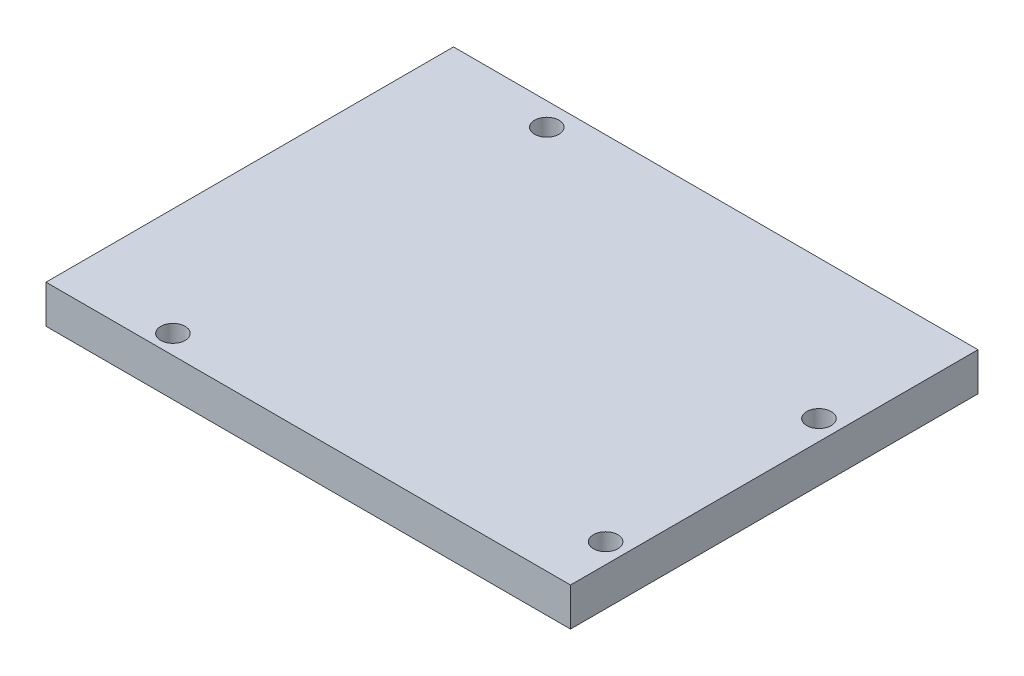
ISO-10303-21;
HEADER;
FILE_DESCRIPTION(('STEP AP214'),'2;1');
FILE_NAME('part.step','',(''),(''),'','','');
FILE_SCHEMA(('AUTOMOTIVE_DESIGN { 1 0 10303 214 1 1 1 1 }'));
ENDSEC;
DATA;
#1=APPLICATION_CONTEXT('core data for automotive mechanical design processes');
#2=APPLICATION_PROTOCOL_DEFINITION('international standard','automotive_design',2000,#1);
#3=PRODUCT_CONTEXT('',#1,'mechanical');
#4=PRODUCT('Part','Part','',(#3));
#5=PRODUCT_RELATED_PRODUCT_CATEGORY('part','',(#4));
#6=PRODUCT_DEFINITION_FORMATION('','',#4);
#7=PRODUCT_DEFINITION_CONTEXT('part definition',#1,'design');
#8=PRODUCT_DEFINITION('design','',#6,#7);
#9=PRODUCT_DEFINITION_SHAPE('','',#8);
#10=(LENGTH_UNIT() NAMED_UNIT(*) SI_UNIT(.MILLI.,.METRE.));
#11=(NAMED_UNIT(*) PLANE_ANGLE_UNIT() SI_UNIT($,.RADIAN.));
#12=(NAMED_UNIT(*) SI_UNIT($,.STERADIAN.) SOLID_ANGLE_UNIT());
#13=UNCERTAINTY_MEASURE_WITH_UNIT(LENGTH_MEASURE(1.E-05),#10,'distance_accuracy_value','');
#14=(GEOMETRIC_REPRESENTATION_CONTEXT(3) GLOBAL_UNCERTAINTY_ASSIGNED_CONTEXT((#13)) GLOBAL_UNIT_ASSIGNED_CONTEXT((#10,
#11,#12)) REPRESENTATION_CONTEXT('',''));
#15=CARTESIAN_POINT('',(0.,0.,0.));
#16=DIRECTION('',(0.,0.,1.));
#17=DIRECTION('',(1.,0.,0.));
#18=AXIS2_PLACEMENT_3D('',#15,#16,#17);
#19=CARTESIAN_POINT('',(0.,5.,0.));
#20=DIRECTION('',(0.,-1.,0.));
#21=DIRECTION('',(0.,0.,-1.));
#22=AXIS2_PLACEMENT_3D('',#19,#20,#21);
#23=PLANE('',#22);
#24=DIRECTION('',(0.,0.,1.));
#25=VECTOR('',#24,1.);
#26=CARTESIAN_POINT('',(-35.5276832904799,5.,25.6269305912668));
#27=LINE('',#26,#25);
#28=CARTESIAN_POINT('',(-35.5276832904799,5.,-27.6730694087332));
#29=VERTEX_POINT('',#28);
#30=CARTESIAN_POINT('',(-35.5276832904799,5.,25.6269305912668));
#31=VERTEX_POINT('',#30);
#32=EDGE_CURVE('E84',#29,#31,#27,.T.);
#33=ORIENTED_EDGE('',*,*,#32,.T.);
#34=DIRECTION('',(1.,0.,0.));
#35=VECTOR('',#34,1.);
#36=CARTESIAN_POINT('',(-35.5276832904799,5.,25.6269305912668));
#37=LINE('',#36,#35);
#38=CARTESIAN_POINT('',(33.0723167095201,5.,25.6269305912668));
#39=VERTEX_POINT('',#38);
#40=EDGE_CURVE('E79',#31,#39,#37,.T.);
#41=ORIENTED_EDGE('',*,*,#40,.T.);
#42=DIRECTION('',(0.,0.,-1.));
#43=VECTOR('',#42,1.);
#44=CARTESIAN_POINT('',(33.0723167095201,5.,25.6269305912668));
#45=LINE('',#44,#43);
#46=CARTESIAN_POINT('',(33.0723167095201,5.,-27.6730694087332));
#47=VERTEX_POINT('',#46);
#48=EDGE_CURVE('E82',#39,#47,#45,.T.);
#49=ORIENTED_EDGE('',*,*,#48,.T.);
#50=DIRECTION('',(-1.,0.,0.));
#51=VECTOR('',#50,1.);
#52=CARTESIAN_POINT('',(-35.5276832904799,5.,-27.6730694087332));
#53=LINE('',#52,#51);
#54=EDGE_CURVE('E49',#47,#29,#53,.T.);
#55=ORIENTED_EDGE('',*,*,#54,.T.);
#56=EDGE_LOOP('',(#33,#41,#49,#55));
#57=FACE_BOUND('',#56,.T.);
#58=CARTESIAN_POINT('',(30.4723167095201,5.,18.4269305912668));
#59=DIRECTION('',(0.,1.,0.));
#60=DIRECTION('',(0.,0.,1.));
#61=AXIS2_PLACEMENT_3D('',#58,#59,#60);
#62=CIRCLE('',#61,1.6);
#63=CARTESIAN_POINT('',(30.4723167095201,5.,20.0269305912668));
#64=VERTEX_POINT('',#63);
#65=EDGE_CURVE('E99',#64,#64,#62,.T.);
#66=ORIENTED_EDGE('',*,*,#65,.F.);
#67=EDGE_LOOP('',(#66));
#68=FACE_BOUND('',#67,.T.);
#69=CARTESIAN_POINT('',(30.4723167095201,5.,-9.47306940873323));
#70=DIRECTION('',(0.,1.,0.));
#71=DIRECTION('',(0.,0.,1.));
#72=AXIS2_PLACEMENT_3D('',#69,#70,#71);
#73=CIRCLE('',#72,1.60000000000001);
#74=CARTESIAN_POINT('',(30.4723167095201,5.,-7.87306940873322));
#75=VERTEX_POINT('',#74);
#76=EDGE_CURVE('E114',#75,#75,#73,.T.);
#77=ORIENTED_EDGE('',*,*,#76,.F.);
#78=EDGE_LOOP('',(#77));
#79=FACE_BOUND('',#78,.T.);
#80=CARTESIAN_POINT('',(-20.3276832904799,5.,-24.6730694087332));
#81=DIRECTION('',(0.,1.,0.));
#82=DIRECTION('',(0.,0.,1.));
#83=AXIS2_PLACEMENT_3D('',#80,#81,#82);
#84=CIRCLE('',#83,1.60000000000001);
#85=CARTESIAN_POINT('',(-20.3276832904799,5.,-23.0730694087332));
#86=VERTEX_POINT('',#85);
#87=EDGE_CURVE('E120',#86,#86,#84,.T.);
#88=ORIENTED_EDGE('',*,*,#87,.F.);
#89=EDGE_LOOP('',(#88));
#90=FACE_BOUND('',#89,.T.);
#91=CARTESIAN_POINT('',(-21.4276832904799,5.,23.1269305912668));
#92=DIRECTION('',(0.,1.,0.));
#93=DIRECTION('',(0.,0.,1.));
#94=AXIS2_PLACEMENT_3D('',#91,#92,#93);
#95=CIRCLE('',#94,1.59999999999999);
#96=CARTESIAN_POINT('',(-21.4276832904799,5.,24.7269305912668));
#97=VERTEX_POINT('',#96);
#98=EDGE_CURVE('E126',#97,#97,#95,.T.);
#99=ORIENTED_EDGE('',*,*,#98,.F.);
#100=EDGE_LOOP('',(#99));
#101=FACE_BOUND('',#100,.T.);
#102=ADVANCED_FACE('F32',(#57,#68,#79,#90,#101),#23,.F.);
#103=CARTESIAN_POINT('',(0.,0.,0.));
#104=DIRECTION('',(0.,-1.,0.));
#105=DIRECTION('',(0.,0.,-1.));
#106=AXIS2_PLACEMENT_3D('',#103,#104,#105);
#107=PLANE('',#106);
#108=CARTESIAN_POINT('',(-20.3276832904799,0.,-24.6730694087332));
#109=DIRECTION('',(0.,1.,0.));
#110=DIRECTION('',(0.,0.,1.));
#111=AXIS2_PLACEMENT_3D('',#108,#109,#110);
#112=CIRCLE('',#111,1.60000000000001);
#113=CARTESIAN_POINT('',(-20.3276832904799,0.,-23.0730694087332));
#114=VERTEX_POINT('',#113);
#115=EDGE_CURVE('E123',#114,#114,#112,.T.);
#116=ORIENTED_EDGE('',*,*,#115,.T.);
#117=EDGE_LOOP('',(#116));
#118=FACE_BOUND('',#117,.T.);
#119=CARTESIAN_POINT('',(30.4723167095201,0.,18.4269305912668));
#120=DIRECTION('',(0.,1.,0.));
#121=DIRECTION('',(0.,0.,1.));
#122=AXIS2_PLACEMENT_3D('',#119,#120,#121);
#123=CIRCLE('',#122,1.6);
#124=CARTESIAN_POINT('',(30.4723167095201,0.,20.0269305912668));
#125=VERTEX_POINT('',#124);
#126=EDGE_CURVE('E111',#125,#125,#123,.T.);
#127=ORIENTED_EDGE('',*,*,#126,.T.);
#128=EDGE_LOOP('',(#127));
#129=FACE_BOUND('',#128,.T.);
#130=DIRECTION('',(0.,0.,1.));
#131=VECTOR('',#130,1.);
#132=CARTESIAN_POINT('',(-35.5276832904799,0.,25.6269305912668));
#133=LINE('',#132,#131);
#134=CARTESIAN_POINT('',(-35.5276832904799,0.,-27.6730694087332));
#135=VERTEX_POINT('',#134);
#136=CARTESIAN_POINT('',(-35.5276832904799,0.,25.6269305912668));
#137=VERTEX_POINT('',#136);
#138=EDGE_CURVE('E96',#135,#137,#133,.T.);
#139=ORIENTED_EDGE('',*,*,#138,.F.);
#140=DIRECTION('',(-1.,0.,0.));
#141=VECTOR('',#140,1.);
#142=CARTESIAN_POINT('',(-35.5276832904799,0.,-27.6730694087332));
#143=LINE('',#142,#141);
#144=CARTESIAN_POINT('',(33.0723167095201,0.,-27.6730694087332));
#145=VERTEX_POINT('',#144);
#146=EDGE_CURVE('E72',#145,#135,#143,.T.);
#147=ORIENTED_EDGE('',*,*,#146,.F.);
#148=DIRECTION('',(0.,0.,-1.));
#149=VECTOR('',#148,1.);
#150=CARTESIAN_POINT('',(33.0723167095201,0.,25.6269305912668));
#151=LINE('',#150,#149);
#152=CARTESIAN_POINT('',(33.0723167095201,0.,25.6269305912668));
#153=VERTEX_POINT('',#152);
#154=EDGE_CURVE('E66',#153,#145,#151,.T.);
#155=ORIENTED_EDGE('',*,*,#154,.F.);
#156=DIRECTION('',(1.,0.,0.));
#157=VECTOR('',#156,1.);
#158=CARTESIAN_POINT('',(-35.5276832904799,0.,25.6269305912668));
#159=LINE('',#158,#157);
#160=EDGE_CURVE('E88',#137,#153,#159,.T.);
#161=ORIENTED_EDGE('',*,*,#160,.F.);
#162=EDGE_LOOP('',(#139,#147,#155,#161));
#163=FACE_BOUND('',#162,.T.);
#164=CARTESIAN_POINT('',(30.4723167095201,0.,-9.47306940873323));
#165=DIRECTION('',(0.,1.,0.));
#166=DIRECTION('',(0.,0.,1.));
#167=AXIS2_PLACEMENT_3D('',#164,#165,#166);
#168=CIRCLE('',#167,1.60000000000001);
#169=CARTESIAN_POINT('',(30.4723167095201,0.,-7.87306940873322));
#170=VERTEX_POINT('',#169);
#171=EDGE_CURVE('E117',#170,#170,#168,.T.);
#172=ORIENTED_EDGE('',*,*,#171,.T.);
#173=EDGE_LOOP('',(#172));
#174=FACE_BOUND('',#173,.T.);
#175=CARTESIAN_POINT('',(-21.4276832904799,0.,23.1269305912668));
#176=DIRECTION('',(0.,1.,0.));
#177=DIRECTION('',(0.,0.,1.));
#178=AXIS2_PLACEMENT_3D('',#175,#176,#177);
#179=CIRCLE('',#178,1.59999999999999);
#180=CARTESIAN_POINT('',(-21.4276832904799,0.,24.7269305912668));
#181=VERTEX_POINT('',#180);
#182=EDGE_CURVE('E129',#181,#181,#179,.T.);
#183=ORIENTED_EDGE('',*,*,#182,.T.);
#184=EDGE_LOOP('',(#183));
#185=FACE_BOUND('',#184,.T.);
#186=ADVANCED_FACE('F107',(#118,#129,#163,#174,#185),#107,.T.);
#187=CARTESIAN_POINT('',(-35.5276832904799,5.,25.6269305912668));
#188=DIRECTION('',(1.,0.,0.));
#189=DIRECTION('',(0.,0.,-1.));
#190=AXIS2_PLACEMENT_3D('',#187,#188,#189);
#191=PLANE('',#190);
#192=ORIENTED_EDGE('',*,*,#138,.T.);
#193=DIRECTION('',(0.,-1.,0.));
#194=VECTOR('',#193,1.);
#195=CARTESIAN_POINT('',(-35.5276832904799,5.,25.6269305912668));
#196=LINE('',#195,#194);
#197=EDGE_CURVE('E11',#31,#137,#196,.T.);
#198=ORIENTED_EDGE('',*,*,#197,.F.);
#199=ORIENTED_EDGE('',*,*,#32,.F.);
#200=DIRECTION('',(0.,-1.,0.));
#201=VECTOR('',#200,1.);
#202=CARTESIAN_POINT('',(-35.5276832904799,5.,-27.6730694087332));
#203=LINE('',#202,#201);
#204=EDGE_CURVE('E92',#29,#135,#203,.T.);
#205=ORIENTED_EDGE('',*,*,#204,.T.);
#206=EDGE_LOOP('',(#192,#198,#199,#205));
#207=FACE_BOUND('',#206,.T.);
#208=ADVANCED_FACE('F34',(#207),#191,.F.);
#209=CARTESIAN_POINT('',(-35.5276832904799,5.,25.6269305912668));
#210=DIRECTION('',(0.,0.,-1.));
#211=DIRECTION('',(-1.,0.,0.));
#212=AXIS2_PLACEMENT_3D('',#209,#210,#211);
#213=PLANE('',#212);
#214=ORIENTED_EDGE('',*,*,#160,.T.);
#215=DIRECTION('',(0.,-1.,0.));
#216=VECTOR('',#215,1.);
#217=CARTESIAN_POINT('',(33.0723167095201,5.,25.6269305912668));
#218=LINE('',#217,#216);
#219=EDGE_CURVE('E41',#39,#153,#218,.T.);
#220=ORIENTED_EDGE('',*,*,#219,.F.);
#221=ORIENTED_EDGE('',*,*,#40,.F.);
#222=ORIENTED_EDGE('',*,*,#197,.T.);
#223=EDGE_LOOP('',(#214,#220,#221,#222));
#224=FACE_BOUND('',#223,.T.);
#225=ADVANCED_FACE('F87',(#224),#213,.F.);
#226=CARTESIAN_POINT('',(33.0723167095201,5.,25.6269305912668));
#227=DIRECTION('',(-1.,0.,0.));
#228=DIRECTION('',(0.,0.,1.));
#229=AXIS2_PLACEMENT_3D('',#226,#227,#228);
#230=PLANE('',#229);
#231=ORIENTED_EDGE('',*,*,#154,.T.);
#232=DIRECTION('',(0.,-1.,0.));
#233=VECTOR('',#232,1.);
#234=CARTESIAN_POINT('',(33.0723167095201,5.,-27.6730694087332));
#235=LINE('',#234,#233);
#236=EDGE_CURVE('E89',#47,#145,#235,.T.);
#237=ORIENTED_EDGE('',*,*,#236,.F.);
#238=ORIENTED_EDGE('',*,*,#48,.F.);
#239=ORIENTED_EDGE('',*,*,#219,.T.);
#240=EDGE_LOOP('',(#231,#237,#238,#239));
#241=FACE_BOUND('',#240,.T.);
#242=ADVANCED_FACE('F90',(#241),#230,.F.);
#243=CARTESIAN_POINT('',(-35.5276832904799,5.,-27.6730694087332));
#244=DIRECTION('',(0.,0.,1.));
#245=DIRECTION('',(1.,0.,0.));
#246=AXIS2_PLACEMENT_3D('',#243,#244,#245);
#247=PLANE('',#246);
#248=ORIENTED_EDGE('',*,*,#146,.T.);
#249=ORIENTED_EDGE('',*,*,#204,.F.);
#250=ORIENTED_EDGE('',*,*,#54,.F.);
#251=ORIENTED_EDGE('',*,*,#236,.T.);
#252=EDGE_LOOP('',(#248,#249,#250,#251));
#253=FACE_BOUND('',#252,.T.);
#254=ADVANCED_FACE('F104',(#253),#247,.F.);
#255=CARTESIAN_POINT('',(30.4723167095201,5.,18.4269305912668));
#256=DIRECTION('',(0.,-1.,0.));
#257=DIRECTION('',(0.,0.,-1.));
#258=AXIS2_PLACEMENT_3D('',#255,#256,#257);
#259=CYLINDRICAL_SURFACE('',#258,1.6);
#260=ORIENTED_EDGE('',*,*,#65,.T.);
#261=EDGE_LOOP('',(#260));
#262=FACE_BOUND('',#261,.T.);
#263=ORIENTED_EDGE('',*,*,#126,.F.);
#264=EDGE_LOOP('',(#263));
#265=FACE_BOUND('',#264,.T.);
#266=ADVANCED_FACE('F146',(#262,#265),#259,.F.);
#267=CARTESIAN_POINT('',(30.4723167095201,5.,-9.47306940873323));
#268=DIRECTION('',(0.,-1.,0.));
#269=DIRECTION('',(0.,0.,-1.));
#270=AXIS2_PLACEMENT_3D('',#267,#268,#269);
#271=CYLINDRICAL_SURFACE('',#270,1.60000000000001);
#272=ORIENTED_EDGE('',*,*,#76,.T.);
#273=EDGE_LOOP('',(#272));
#274=FACE_BOUND('',#273,.T.);
#275=ORIENTED_EDGE('',*,*,#171,.F.);
#276=EDGE_LOOP('',(#275));
#277=FACE_BOUND('',#276,.T.);
#278=ADVANCED_FACE('F192',(#274,#277),#271,.F.);
#279=CARTESIAN_POINT('',(-20.3276832904799,5.,-24.6730694087332));
#280=DIRECTION('',(0.,-1.,0.));
#281=DIRECTION('',(0.,0.,-1.));
#282=AXIS2_PLACEMENT_3D('',#279,#280,#281);
#283=CYLINDRICAL_SURFACE('',#282,1.60000000000001);
#284=ORIENTED_EDGE('',*,*,#87,.T.);
#285=EDGE_LOOP('',(#284));
#286=FACE_BOUND('',#285,.T.);
#287=ORIENTED_EDGE('',*,*,#115,.F.);
#288=EDGE_LOOP('',(#287));
#289=FACE_BOUND('',#288,.T.);
#290=ADVANCED_FACE('F200',(#286,#289),#283,.F.);
#291=CARTESIAN_POINT('',(-21.4276832904799,5.,23.1269305912668));
#292=DIRECTION('',(0.,-1.,0.));
#293=DIRECTION('',(0.,0.,-1.));
#294=AXIS2_PLACEMENT_3D('',#291,#292,#293);
#295=CYLINDRICAL_SURFACE('',#294,1.59999999999999);
#296=ORIENTED_EDGE('',*,*,#98,.T.);
#297=EDGE_LOOP('',(#296));
#298=FACE_BOUND('',#297,.T.);
#299=ORIENTED_EDGE('',*,*,#182,.F.);
#300=EDGE_LOOP('',(#299));
#301=FACE_BOUND('',#300,.T.);
#302=ADVANCED_FACE('F135',(#298,#301),#295,.F.);
#303=CLOSED_SHELL('',(#102,#186,#208,#225,#242,#254,#266,#278,#290,#302));
#304=MANIFOLD_SOLID_BREP('B2',#303);
#305=ADVANCED_BREP_SHAPE_REPRESENTATION('',(#18,#304),#14);
#306=SHAPE_DEFINITION_REPRESENTATION(#9,#305);
ENDSEC;
END-ISO-10303-21;
